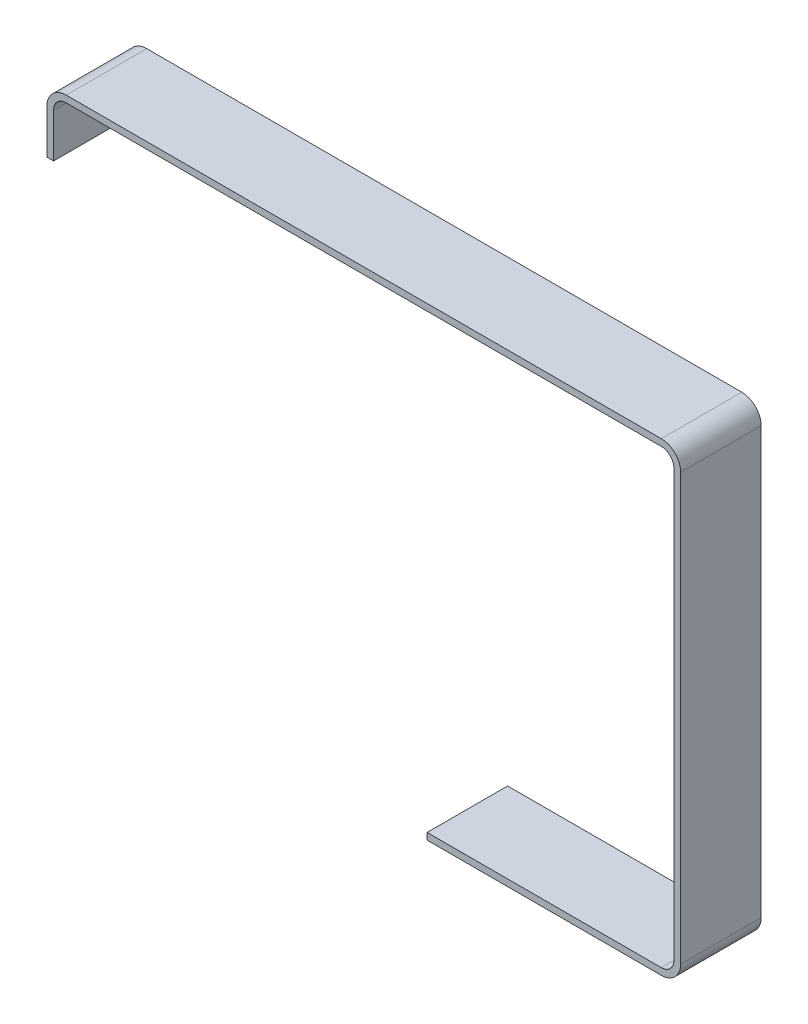
ISO-10303-21;
HEADER;
FILE_DESCRIPTION(('STEP AP214'),'2;1');
FILE_NAME('part.step','',(''),(''),'','','');
FILE_SCHEMA(('AUTOMOTIVE_DESIGN { 1 0 10303 214 1 1 1 1 }'));
ENDSEC;
DATA;
#1=APPLICATION_CONTEXT('core data for automotive mechanical design processes');
#2=APPLICATION_PROTOCOL_DEFINITION('international standard','automotive_design',2000,#1);
#3=PRODUCT_CONTEXT('',#1,'mechanical');
#4=PRODUCT('Part','Part','',(#3));
#5=PRODUCT_RELATED_PRODUCT_CATEGORY('part','',(#4));
#6=PRODUCT_DEFINITION_FORMATION('','',#4);
#7=PRODUCT_DEFINITION_CONTEXT('part definition',#1,'design');
#8=PRODUCT_DEFINITION('design','',#6,#7);
#9=PRODUCT_DEFINITION_SHAPE('','',#8);
#10=(LENGTH_UNIT() NAMED_UNIT(*) SI_UNIT(.MILLI.,.METRE.));
#11=(NAMED_UNIT(*) PLANE_ANGLE_UNIT() SI_UNIT($,.RADIAN.));
#12=(NAMED_UNIT(*) SI_UNIT($,.STERADIAN.) SOLID_ANGLE_UNIT());
#13=UNCERTAINTY_MEASURE_WITH_UNIT(LENGTH_MEASURE(1.E-05),#10,'distance_accuracy_value','');
#14=(GEOMETRIC_REPRESENTATION_CONTEXT(3) GLOBAL_UNCERTAINTY_ASSIGNED_CONTEXT((#13)) GLOBAL_UNIT_ASSIGNED_CONTEXT((#10,
#11,#12)) REPRESENTATION_CONTEXT('',''));
#15=CARTESIAN_POINT('',(0.,0.,0.));
#16=DIRECTION('',(0.,0.,1.));
#17=DIRECTION('',(1.,0.,0.));
#18=AXIS2_PLACEMENT_3D('',#15,#16,#17);
#19=CARTESIAN_POINT('',(-60.,0.,19.05));
#20=DIRECTION('',(1.,0.,0.));
#21=DIRECTION('',(0.,0.,-1.));
#22=AXIS2_PLACEMENT_3D('',#19,#20,#21);
#23=PLANE('',#22);
#24=DIRECTION('',(0.,-1.,0.));
#25=VECTOR('',#24,1.);
#26=CARTESIAN_POINT('',(-60.,0.,0.));
#27=LINE('',#26,#25);
#28=CARTESIAN_POINT('',(-60.,1.5875,0.));
#29=VERTEX_POINT('',#28);
#30=CARTESIAN_POINT('',(-60.,0.,0.));
#31=VERTEX_POINT('',#30);
#32=EDGE_CURVE('E171',#29,#31,#27,.T.);
#33=ORIENTED_EDGE('',*,*,#32,.T.);
#34=DIRECTION('',(0.,0.,-1.));
#35=VECTOR('',#34,1.);
#36=CARTESIAN_POINT('',(-60.,0.,19.05));
#37=LINE('',#36,#35);
#38=CARTESIAN_POINT('',(-60.,0.,19.05));
#39=VERTEX_POINT('',#38);
#40=EDGE_CURVE('E153',#39,#31,#37,.T.);
#41=ORIENTED_EDGE('',*,*,#40,.F.);
#42=DIRECTION('',(0.,-1.,0.));
#43=VECTOR('',#42,1.);
#44=CARTESIAN_POINT('',(-60.,0.,19.05));
#45=LINE('',#44,#43);
#46=CARTESIAN_POINT('',(-60.,1.5875,19.05));
#47=VERTEX_POINT('',#46);
#48=EDGE_CURVE('E159',#47,#39,#45,.T.);
#49=ORIENTED_EDGE('',*,*,#48,.F.);
#50=DIRECTION('',(0.,0.,-1.));
#51=VECTOR('',#50,1.);
#52=CARTESIAN_POINT('',(-60.,1.5875,19.05));
#53=LINE('',#52,#51);
#54=EDGE_CURVE('E256',#47,#29,#53,.T.);
#55=ORIENTED_EDGE('',*,*,#54,.T.);
#56=EDGE_LOOP('',(#33,#41,#49,#55));
#57=FACE_BOUND('',#56,.T.);
#58=ADVANCED_FACE('F33',(#57),#23,.F.);
#59=CARTESIAN_POINT('',(-60.,0.,19.05));
#60=DIRECTION('',(0.,1.,0.));
#61=DIRECTION('',(0.,0.,1.));
#62=AXIS2_PLACEMENT_3D('',#59,#60,#61);
#63=PLANE('',#62);
#64=DIRECTION('',(1.,0.,0.));
#65=VECTOR('',#64,1.);
#66=CARTESIAN_POINT('',(-60.,0.,0.));
#67=LINE('',#66,#65);
#68=CARTESIAN_POINT('',(-4.5875,0.,0.));
#69=VERTEX_POINT('',#68);
#70=EDGE_CURVE('E241',#31,#69,#67,.T.);
#71=ORIENTED_EDGE('',*,*,#70,.T.);
#72=DIRECTION('',(0.,0.,-1.));
#73=VECTOR('',#72,1.);
#74=CARTESIAN_POINT('',(-4.5875,0.,19.05));
#75=LINE('',#74,#73);
#76=CARTESIAN_POINT('',(-4.5875,0.,19.05));
#77=VERTEX_POINT('',#76);
#78=EDGE_CURVE('E156',#69,#77,#75,.F.);
#79=ORIENTED_EDGE('',*,*,#78,.T.);
#80=DIRECTION('',(1.,0.,0.));
#81=VECTOR('',#80,1.);
#82=CARTESIAN_POINT('',(-60.,0.,19.05));
#83=LINE('',#82,#81);
#84=EDGE_CURVE('E148',#39,#77,#83,.T.);
#85=ORIENTED_EDGE('',*,*,#84,.F.);
#86=ORIENTED_EDGE('',*,*,#40,.T.);
#87=EDGE_LOOP('',(#71,#79,#85,#86));
#88=FACE_BOUND('',#87,.T.);
#89=ADVANCED_FACE('F151',(#88),#63,.F.);
#90=CARTESIAN_POINT('',(0.,0.,19.05));
#91=DIRECTION('',(-1.,0.,0.));
#92=DIRECTION('',(0.,0.,1.));
#93=AXIS2_PLACEMENT_3D('',#90,#91,#92);
#94=PLANE('',#93);
#95=DIRECTION('',(0.,1.,0.));
#96=VECTOR('',#95,1.);
#97=CARTESIAN_POINT('',(0.,0.,19.05));
#98=LINE('',#97,#96);
#99=CARTESIAN_POINT('',(0.,4.5875,19.05));
#100=VERTEX_POINT('',#99);
#101=CARTESIAN_POINT('',(0.,105.4125,19.05));
#102=VERTEX_POINT('',#101);
#103=EDGE_CURVE('E158',#100,#102,#98,.T.);
#104=ORIENTED_EDGE('',*,*,#103,.F.);
#105=DIRECTION('',(0.,0.,-1.));
#106=VECTOR('',#105,1.);
#107=CARTESIAN_POINT('',(0.,4.5875,19.05));
#108=LINE('',#107,#106);
#109=CARTESIAN_POINT('',(0.,4.5875,0.));
#110=VERTEX_POINT('',#109);
#111=EDGE_CURVE('E208',#100,#110,#108,.T.);
#112=ORIENTED_EDGE('',*,*,#111,.T.);
#113=DIRECTION('',(0.,1.,0.));
#114=VECTOR('',#113,1.);
#115=CARTESIAN_POINT('',(0.,0.,0.));
#116=LINE('',#115,#114);
#117=CARTESIAN_POINT('',(0.,105.4125,0.));
#118=VERTEX_POINT('',#117);
#119=EDGE_CURVE('E237',#110,#118,#116,.T.);
#120=ORIENTED_EDGE('',*,*,#119,.T.);
#121=DIRECTION('',(0.,0.,-1.));
#122=VECTOR('',#121,1.);
#123=CARTESIAN_POINT('',(0.,105.4125,19.05));
#124=LINE('',#123,#122);
#125=EDGE_CURVE('E206',#118,#102,#124,.F.);
#126=ORIENTED_EDGE('',*,*,#125,.T.);
#127=EDGE_LOOP('',(#104,#112,#120,#126));
#128=FACE_BOUND('',#127,.T.);
#129=ADVANCED_FACE('F296',(#128),#94,.F.);
#130=CARTESIAN_POINT('',(0.,110.,19.05));
#131=DIRECTION('',(0.,-1.,0.));
#132=DIRECTION('',(0.,0.,-1.));
#133=AXIS2_PLACEMENT_3D('',#130,#131,#132);
#134=PLANE('',#133);
#135=DIRECTION('',(-1.,0.,0.));
#136=VECTOR('',#135,1.);
#137=CARTESIAN_POINT('',(0.,110.,19.05));
#138=LINE('',#137,#136);
#139=CARTESIAN_POINT('',(-4.5875,110.,19.05));
#140=VERTEX_POINT('',#139);
#141=CARTESIAN_POINT('',(-145.4125,110.,19.05));
#142=VERTEX_POINT('',#141);
#143=EDGE_CURVE('E228',#140,#142,#138,.T.);
#144=ORIENTED_EDGE('',*,*,#143,.F.);
#145=DIRECTION('',(0.,0.,-1.));
#146=VECTOR('',#145,1.);
#147=CARTESIAN_POINT('',(-4.5875,110.,19.05));
#148=LINE('',#147,#146);
#149=CARTESIAN_POINT('',(-4.5875,110.,0.));
#150=VERTEX_POINT('',#149);
#151=EDGE_CURVE('E41',#140,#150,#148,.T.);
#152=ORIENTED_EDGE('',*,*,#151,.T.);
#153=DIRECTION('',(-1.,0.,0.));
#154=VECTOR('',#153,1.);
#155=CARTESIAN_POINT('',(0.,110.,0.));
#156=LINE('',#155,#154);
#157=CARTESIAN_POINT('',(-145.4125,110.,0.));
#158=VERTEX_POINT('',#157);
#159=EDGE_CURVE('E227',#150,#158,#156,.T.);
#160=ORIENTED_EDGE('',*,*,#159,.T.);
#161=DIRECTION('',(0.,0.,-1.));
#162=VECTOR('',#161,1.);
#163=CARTESIAN_POINT('',(-145.4125,110.,19.05));
#164=LINE('',#163,#162);
#165=EDGE_CURVE('E56',#158,#142,#164,.F.);
#166=ORIENTED_EDGE('',*,*,#165,.T.);
#167=EDGE_LOOP('',(#144,#152,#160,#166));
#168=FACE_BOUND('',#167,.T.);
#169=ADVANCED_FACE('F226',(#168),#134,.F.);
#170=CARTESIAN_POINT('',(-150.,110.,19.05));
#171=DIRECTION('',(1.,0.,0.));
#172=DIRECTION('',(0.,1.,0.));
#173=AXIS2_PLACEMENT_3D('',#170,#171,#172);
#174=PLANE('',#173);
#175=DIRECTION('',(0.,-1.,0.));
#176=VECTOR('',#175,1.);
#177=CARTESIAN_POINT('',(-150.,110.,19.05));
#178=LINE('',#177,#176);
#179=CARTESIAN_POINT('',(-150.,105.4125,19.05));
#180=VERTEX_POINT('',#179);
#181=CARTESIAN_POINT('',(-150.,95.,19.05));
#182=VERTEX_POINT('',#181);
#183=EDGE_CURVE('E299',#180,#182,#178,.T.);
#184=ORIENTED_EDGE('',*,*,#183,.F.);
#185=DIRECTION('',(0.,0.,-1.));
#186=VECTOR('',#185,1.);
#187=CARTESIAN_POINT('',(-150.,105.4125,19.05));
#188=LINE('',#187,#186);
#189=CARTESIAN_POINT('',(-150.,105.4125,0.));
#190=VERTEX_POINT('',#189);
#191=EDGE_CURVE('E11',#180,#190,#188,.T.);
#192=ORIENTED_EDGE('',*,*,#191,.T.);
#193=DIRECTION('',(0.,-1.,0.));
#194=VECTOR('',#193,1.);
#195=CARTESIAN_POINT('',(-150.,110.,0.));
#196=LINE('',#195,#194);
#197=CARTESIAN_POINT('',(-150.,95.,0.));
#198=VERTEX_POINT('',#197);
#199=EDGE_CURVE('E236',#190,#198,#196,.T.);
#200=ORIENTED_EDGE('',*,*,#199,.T.);
#201=DIRECTION('',(0.,0.,-1.));
#202=VECTOR('',#201,1.);
#203=CARTESIAN_POINT('',(-150.,95.,19.05));
#204=LINE('',#203,#202);
#205=EDGE_CURVE('E173',#182,#198,#204,.T.);
#206=ORIENTED_EDGE('',*,*,#205,.F.);
#207=EDGE_LOOP('',(#184,#192,#200,#206));
#208=FACE_BOUND('',#207,.T.);
#209=ADVANCED_FACE('F305',(#208),#174,.F.);
#210=CARTESIAN_POINT('',(-150.,95.,19.05));
#211=DIRECTION('',(0.,1.,0.));
#212=DIRECTION('',(0.,0.,1.));
#213=AXIS2_PLACEMENT_3D('',#210,#211,#212);
#214=PLANE('',#213);
#215=DIRECTION('',(1.,0.,0.));
#216=VECTOR('',#215,1.);
#217=CARTESIAN_POINT('',(-150.,95.,0.));
#218=LINE('',#217,#216);
#219=CARTESIAN_POINT('',(-148.4125,95.,0.));
#220=VERTEX_POINT('',#219);
#221=EDGE_CURVE('E239',#198,#220,#218,.T.);
#222=ORIENTED_EDGE('',*,*,#221,.T.);
#223=DIRECTION('',(0.,0.,-1.));
#224=VECTOR('',#223,1.);
#225=CARTESIAN_POINT('',(-148.4125,95.,19.05));
#226=LINE('',#225,#224);
#227=CARTESIAN_POINT('',(-148.4125,95.,19.05));
#228=VERTEX_POINT('',#227);
#229=EDGE_CURVE('E179',#228,#220,#226,.T.);
#230=ORIENTED_EDGE('',*,*,#229,.F.);
#231=DIRECTION('',(1.,0.,0.));
#232=VECTOR('',#231,1.);
#233=CARTESIAN_POINT('',(-150.,95.,19.05));
#234=LINE('',#233,#232);
#235=EDGE_CURVE('E285',#182,#228,#234,.T.);
#236=ORIENTED_EDGE('',*,*,#235,.F.);
#237=ORIENTED_EDGE('',*,*,#205,.T.);
#238=EDGE_LOOP('',(#222,#230,#236,#237));
#239=FACE_BOUND('',#238,.T.);
#240=ADVANCED_FACE('F303',(#239),#214,.F.);
#241=CARTESIAN_POINT('',(-148.4125,108.4125,19.05));
#242=DIRECTION('',(-1.,0.,0.));
#243=DIRECTION('',(0.,0.,1.));
#244=AXIS2_PLACEMENT_3D('',#241,#242,#243);
#245=PLANE('',#244);
#246=DIRECTION('',(0.,1.,0.));
#247=VECTOR('',#246,1.);
#248=CARTESIAN_POINT('',(-148.4125,108.4125,0.));
#249=LINE('',#248,#247);
#250=CARTESIAN_POINT('',(-148.4125,105.4125,0.));
#251=VERTEX_POINT('',#250);
#252=EDGE_CURVE('E246',#220,#251,#249,.T.);
#253=ORIENTED_EDGE('',*,*,#252,.T.);
#254=DIRECTION('',(0.,0.,-1.));
#255=VECTOR('',#254,1.);
#256=CARTESIAN_POINT('',(-148.4125,105.4125,19.05));
#257=LINE('',#256,#255);
#258=CARTESIAN_POINT('',(-148.4125,105.4125,19.05));
#259=VERTEX_POINT('',#258);
#260=EDGE_CURVE('E192',#251,#259,#257,.F.);
#261=ORIENTED_EDGE('',*,*,#260,.T.);
#262=DIRECTION('',(0.,1.,0.));
#263=VECTOR('',#262,1.);
#264=CARTESIAN_POINT('',(-148.4125,108.4125,19.05));
#265=LINE('',#264,#263);
#266=EDGE_CURVE('E265',#228,#259,#265,.T.);
#267=ORIENTED_EDGE('',*,*,#266,.F.);
#268=ORIENTED_EDGE('',*,*,#229,.T.);
#269=EDGE_LOOP('',(#253,#261,#267,#268));
#270=FACE_BOUND('',#269,.T.);
#271=ADVANCED_FACE('F262',(#270),#245,.F.);
#272=CARTESIAN_POINT('',(-1.5875,108.4125,19.05));
#273=DIRECTION('',(0.,1.,0.));
#274=DIRECTION('',(-1.,0.,0.));
#275=AXIS2_PLACEMENT_3D('',#272,#273,#274);
#276=PLANE('',#275);
#277=DIRECTION('',(1.,0.,0.));
#278=VECTOR('',#277,1.);
#279=CARTESIAN_POINT('',(-1.5875,108.4125,0.));
#280=LINE('',#279,#278);
#281=CARTESIAN_POINT('',(-145.4125,108.4125,0.));
#282=VERTEX_POINT('',#281);
#283=CARTESIAN_POINT('',(-4.5875,108.4125,0.));
#284=VERTEX_POINT('',#283);
#285=EDGE_CURVE('E249',#282,#284,#280,.T.);
#286=ORIENTED_EDGE('',*,*,#285,.T.);
#287=DIRECTION('',(0.,0.,-1.));
#288=VECTOR('',#287,1.);
#289=CARTESIAN_POINT('',(-4.5875,108.4125,19.05));
#290=LINE('',#289,#288);
#291=CARTESIAN_POINT('',(-4.5875,108.4125,19.05));
#292=VERTEX_POINT('',#291);
#293=EDGE_CURVE('E190',#284,#292,#290,.F.);
#294=ORIENTED_EDGE('',*,*,#293,.T.);
#295=DIRECTION('',(1.,0.,0.));
#296=VECTOR('',#295,1.);
#297=CARTESIAN_POINT('',(-1.5875,108.4125,19.05));
#298=LINE('',#297,#296);
#299=CARTESIAN_POINT('',(-145.4125,108.4125,19.05));
#300=VERTEX_POINT('',#299);
#301=EDGE_CURVE('E279',#300,#292,#298,.T.);
#302=ORIENTED_EDGE('',*,*,#301,.F.);
#303=DIRECTION('',(0.,0.,-1.));
#304=VECTOR('',#303,1.);
#305=CARTESIAN_POINT('',(-145.4125,108.4125,0.));
#306=LINE('',#305,#304);
#307=EDGE_CURVE('E187',#300,#282,#306,.T.);
#308=ORIENTED_EDGE('',*,*,#307,.T.);
#309=EDGE_LOOP('',(#286,#294,#302,#308));
#310=FACE_BOUND('',#309,.T.);
#311=ADVANCED_FACE('F276',(#310),#276,.F.);
#312=CARTESIAN_POINT('',(-1.5875,1.5875,19.05));
#313=DIRECTION('',(1.,0.,0.));
#314=DIRECTION('',(0.,0.,-1.));
#315=AXIS2_PLACEMENT_3D('',#312,#313,#314);
#316=PLANE('',#315);
#317=DIRECTION('',(0.,-1.,0.));
#318=VECTOR('',#317,1.);
#319=CARTESIAN_POINT('',(-1.5875,1.5875,0.));
#320=LINE('',#319,#318);
#321=CARTESIAN_POINT('',(-1.5875,105.4125,0.));
#322=VERTEX_POINT('',#321);
#323=CARTESIAN_POINT('',(-1.5875,4.5875,0.));
#324=VERTEX_POINT('',#323);
#325=EDGE_CURVE('E252',#322,#324,#320,.T.);
#326=ORIENTED_EDGE('',*,*,#325,.T.);
#327=DIRECTION('',(0.,0.,-1.));
#328=VECTOR('',#327,1.);
#329=CARTESIAN_POINT('',(-1.5875,4.5875,19.05));
#330=LINE('',#329,#328);
#331=CARTESIAN_POINT('',(-1.5875,4.5875,19.05));
#332=VERTEX_POINT('',#331);
#333=EDGE_CURVE('E185',#324,#332,#330,.F.);
#334=ORIENTED_EDGE('',*,*,#333,.T.);
#335=DIRECTION('',(0.,-1.,0.));
#336=VECTOR('',#335,1.);
#337=CARTESIAN_POINT('',(-1.5875,1.5875,19.05));
#338=LINE('',#337,#336);
#339=CARTESIAN_POINT('',(-1.5875,105.4125,19.05));
#340=VERTEX_POINT('',#339);
#341=EDGE_CURVE('E281',#340,#332,#338,.T.);
#342=ORIENTED_EDGE('',*,*,#341,.F.);
#343=DIRECTION('',(0.,0.,-1.));
#344=VECTOR('',#343,1.);
#345=CARTESIAN_POINT('',(-1.5875,105.4125,0.));
#346=LINE('',#345,#344);
#347=EDGE_CURVE('E176',#340,#322,#346,.T.);
#348=ORIENTED_EDGE('',*,*,#347,.T.);
#349=EDGE_LOOP('',(#326,#334,#342,#348));
#350=FACE_BOUND('',#349,.T.);
#351=ADVANCED_FACE('F387',(#350),#316,.F.);
#352=CARTESIAN_POINT('',(-60.,1.5875,19.05));
#353=DIRECTION('',(0.,-1.,0.));
#354=DIRECTION('',(0.,0.,-1.));
#355=AXIS2_PLACEMENT_3D('',#352,#353,#354);
#356=PLANE('',#355);
#357=DIRECTION('',(-1.,0.,0.));
#358=VECTOR('',#357,1.);
#359=CARTESIAN_POINT('',(-60.,1.5875,19.05));
#360=LINE('',#359,#358);
#361=CARTESIAN_POINT('',(-4.58750000000002,1.5875,19.05));
#362=VERTEX_POINT('',#361);
#363=EDGE_CURVE('E164',#362,#47,#360,.T.);
#364=ORIENTED_EDGE('',*,*,#363,.F.);
#365=DIRECTION('',(0.,0.,-1.));
#366=VECTOR('',#365,1.);
#367=CARTESIAN_POINT('',(-4.5875,1.5875,0.));
#368=LINE('',#367,#366);
#369=CARTESIAN_POINT('',(-4.58750000000002,1.5875,0.));
#370=VERTEX_POINT('',#369);
#371=EDGE_CURVE('E172',#362,#370,#368,.T.);
#372=ORIENTED_EDGE('',*,*,#371,.T.);
#373=DIRECTION('',(-1.,0.,0.));
#374=VECTOR('',#373,1.);
#375=CARTESIAN_POINT('',(-60.,1.5875,0.));
#376=LINE('',#375,#374);
#377=EDGE_CURVE('E168',#370,#29,#376,.T.);
#378=ORIENTED_EDGE('',*,*,#377,.T.);
#379=ORIENTED_EDGE('',*,*,#54,.F.);
#380=EDGE_LOOP('',(#364,#372,#378,#379));
#381=FACE_BOUND('',#380,.T.);
#382=ADVANCED_FACE('F379',(#381),#356,.F.);
#383=CARTESIAN_POINT('',(0.,0.,19.05));
#384=DIRECTION('',(0.,0.,-1.));
#385=DIRECTION('',(-1.,0.,0.));
#386=AXIS2_PLACEMENT_3D('',#383,#384,#385);
#387=PLANE('',#386);
#388=ORIENTED_EDGE('',*,*,#84,.T.);
#389=CARTESIAN_POINT('',(-4.5875,4.5875,19.05));
#390=DIRECTION('',(0.,0.,-1.));
#391=DIRECTION('',(-1.,0.,0.));
#392=AXIS2_PLACEMENT_3D('',#389,#390,#391);
#393=CIRCLE('',#392,4.5875);
#394=EDGE_CURVE('E221',#77,#100,#393,.F.);
#395=ORIENTED_EDGE('',*,*,#394,.T.);
#396=ORIENTED_EDGE('',*,*,#103,.T.);
#397=CARTESIAN_POINT('',(-4.5875,105.4125,19.05));
#398=DIRECTION('',(0.,0.,-1.));
#399=DIRECTION('',(-1.,0.,0.));
#400=AXIS2_PLACEMENT_3D('',#397,#398,#399);
#401=CIRCLE('',#400,4.5875);
#402=EDGE_CURVE('E219',#102,#140,#401,.F.);
#403=ORIENTED_EDGE('',*,*,#402,.T.);
#404=ORIENTED_EDGE('',*,*,#143,.T.);
#405=CARTESIAN_POINT('',(-145.4125,105.4125,19.05));
#406=DIRECTION('',(0.,0.,-1.));
#407=DIRECTION('',(-1.,0.,0.));
#408=AXIS2_PLACEMENT_3D('',#405,#406,#407);
#409=CIRCLE('',#408,4.5875);
#410=EDGE_CURVE('E48',#142,#180,#409,.F.);
#411=ORIENTED_EDGE('',*,*,#410,.T.);
#412=ORIENTED_EDGE('',*,*,#183,.T.);
#413=ORIENTED_EDGE('',*,*,#235,.T.);
#414=ORIENTED_EDGE('',*,*,#266,.T.);
#415=CARTESIAN_POINT('',(-145.4125,105.4125,19.05));
#416=DIRECTION('',(0.,0.,-1.));
#417=DIRECTION('',(-1.,0.,0.));
#418=AXIS2_PLACEMENT_3D('',#415,#416,#417);
#419=CIRCLE('',#418,3.);
#420=EDGE_CURVE('E204',#259,#300,#419,.T.);
#421=ORIENTED_EDGE('',*,*,#420,.T.);
#422=ORIENTED_EDGE('',*,*,#301,.T.);
#423=CARTESIAN_POINT('',(-4.5875,105.4125,19.05));
#424=DIRECTION('',(0.,0.,-1.));
#425=DIRECTION('',(-1.,0.,0.));
#426=AXIS2_PLACEMENT_3D('',#423,#424,#425);
#427=CIRCLE('',#426,3.);
#428=EDGE_CURVE('E200',#292,#340,#427,.T.);
#429=ORIENTED_EDGE('',*,*,#428,.T.);
#430=ORIENTED_EDGE('',*,*,#341,.T.);
#431=CARTESIAN_POINT('',(-4.5875,4.5875,19.05));
#432=DIRECTION('',(0.,0.,-1.));
#433=DIRECTION('',(-1.,0.,0.));
#434=AXIS2_PLACEMENT_3D('',#431,#432,#433);
#435=CIRCLE('',#434,3.);
#436=EDGE_CURVE('E196',#332,#362,#435,.T.);
#437=ORIENTED_EDGE('',*,*,#436,.T.);
#438=ORIENTED_EDGE('',*,*,#363,.T.);
#439=ORIENTED_EDGE('',*,*,#48,.T.);
#440=EDGE_LOOP('',(#388,#395,#396,#403,#404,#411,#412,#413,#414,#421,#422,#429,#430,#437,#438,#439));
#441=FACE_BOUND('',#440,.T.);
#442=ADVANCED_FACE('F162',(#441),#387,.F.);
#443=CARTESIAN_POINT('',(0.,0.,0.));
#444=DIRECTION('',(0.,0.,-1.));
#445=DIRECTION('',(-1.,0.,0.));
#446=AXIS2_PLACEMENT_3D('',#443,#444,#445);
#447=PLANE('',#446);
#448=ORIENTED_EDGE('',*,*,#119,.F.);
#449=CARTESIAN_POINT('',(-4.5875,4.5875,0.));
#450=DIRECTION('',(0.,0.,-1.));
#451=DIRECTION('',(-1.,0.,0.));
#452=AXIS2_PLACEMENT_3D('',#449,#450,#451);
#453=CIRCLE('',#452,4.5875);
#454=EDGE_CURVE('E215',#110,#69,#453,.T.);
#455=ORIENTED_EDGE('',*,*,#454,.T.);
#456=ORIENTED_EDGE('',*,*,#70,.F.);
#457=ORIENTED_EDGE('',*,*,#32,.F.);
#458=ORIENTED_EDGE('',*,*,#377,.F.);
#459=CARTESIAN_POINT('',(-4.5875,4.5875,0.));
#460=DIRECTION('',(0.,0.,-1.));
#461=DIRECTION('',(-1.,0.,0.));
#462=AXIS2_PLACEMENT_3D('',#459,#460,#461);
#463=CIRCLE('',#462,3.);
#464=EDGE_CURVE('E194',#370,#324,#463,.F.);
#465=ORIENTED_EDGE('',*,*,#464,.T.);
#466=ORIENTED_EDGE('',*,*,#325,.F.);
#467=CARTESIAN_POINT('',(-4.5875,105.4125,0.));
#468=DIRECTION('',(0.,0.,-1.));
#469=DIRECTION('',(-1.,0.,0.));
#470=AXIS2_PLACEMENT_3D('',#467,#468,#469);
#471=CIRCLE('',#470,3.);
#472=EDGE_CURVE('E198',#322,#284,#471,.F.);
#473=ORIENTED_EDGE('',*,*,#472,.T.);
#474=ORIENTED_EDGE('',*,*,#285,.F.);
#475=CARTESIAN_POINT('',(-145.4125,105.4125,0.));
#476=DIRECTION('',(0.,0.,-1.));
#477=DIRECTION('',(-1.,0.,0.));
#478=AXIS2_PLACEMENT_3D('',#475,#476,#477);
#479=CIRCLE('',#478,3.);
#480=EDGE_CURVE('E202',#282,#251,#479,.F.);
#481=ORIENTED_EDGE('',*,*,#480,.T.);
#482=ORIENTED_EDGE('',*,*,#252,.F.);
#483=ORIENTED_EDGE('',*,*,#221,.F.);
#484=ORIENTED_EDGE('',*,*,#199,.F.);
#485=CARTESIAN_POINT('',(-145.4125,105.4125,0.));
#486=DIRECTION('',(0.,0.,-1.));
#487=DIRECTION('',(-1.,0.,0.));
#488=AXIS2_PLACEMENT_3D('',#485,#486,#487);
#489=CIRCLE('',#488,4.5875);
#490=EDGE_CURVE('E211',#190,#158,#489,.T.);
#491=ORIENTED_EDGE('',*,*,#490,.T.);
#492=ORIENTED_EDGE('',*,*,#159,.F.);
#493=CARTESIAN_POINT('',(-4.5875,105.4125,0.));
#494=DIRECTION('',(0.,0.,-1.));
#495=DIRECTION('',(-1.,0.,0.));
#496=AXIS2_PLACEMENT_3D('',#493,#494,#495);
#497=CIRCLE('',#496,4.5875);
#498=EDGE_CURVE('E213',#150,#118,#497,.T.);
#499=ORIENTED_EDGE('',*,*,#498,.T.);
#500=EDGE_LOOP('',(#448,#455,#456,#457,#458,#465,#466,#473,#474,#481,#482,#483,#484,#491,#492,#499));
#501=FACE_BOUND('',#500,.T.);
#502=ADVANCED_FACE('F233',(#501),#447,.T.);
#503=CARTESIAN_POINT('',(-4.5875,4.5875,19.05));
#504=DIRECTION('',(0.,0.,1.));
#505=DIRECTION('',(1.,0.,0.));
#506=AXIS2_PLACEMENT_3D('',#503,#504,#505);
#507=CYLINDRICAL_SURFACE('',#506,3.);
#508=ORIENTED_EDGE('',*,*,#436,.F.);
#509=ORIENTED_EDGE('',*,*,#333,.F.);
#510=ORIENTED_EDGE('',*,*,#464,.F.);
#511=ORIENTED_EDGE('',*,*,#371,.F.);
#512=EDGE_LOOP('',(#508,#509,#510,#511));
#513=FACE_BOUND('',#512,.T.);
#514=ADVANCED_FACE('F321',(#513),#507,.F.);
#515=CARTESIAN_POINT('',(-4.5875,105.4125,19.05));
#516=DIRECTION('',(0.,0.,1.));
#517=DIRECTION('',(1.,0.,0.));
#518=AXIS2_PLACEMENT_3D('',#515,#516,#517);
#519=CYLINDRICAL_SURFACE('',#518,3.);
#520=ORIENTED_EDGE('',*,*,#428,.F.);
#521=ORIENTED_EDGE('',*,*,#293,.F.);
#522=ORIENTED_EDGE('',*,*,#472,.F.);
#523=ORIENTED_EDGE('',*,*,#347,.F.);
#524=EDGE_LOOP('',(#520,#521,#522,#523));
#525=FACE_BOUND('',#524,.T.);
#526=ADVANCED_FACE('F324',(#525),#519,.F.);
#527=CARTESIAN_POINT('',(-145.4125,105.4125,19.05));
#528=DIRECTION('',(0.,0.,1.));
#529=DIRECTION('',(1.,0.,0.));
#530=AXIS2_PLACEMENT_3D('',#527,#528,#529);
#531=CYLINDRICAL_SURFACE('',#530,3.);
#532=ORIENTED_EDGE('',*,*,#420,.F.);
#533=ORIENTED_EDGE('',*,*,#260,.F.);
#534=ORIENTED_EDGE('',*,*,#480,.F.);
#535=ORIENTED_EDGE('',*,*,#307,.F.);
#536=EDGE_LOOP('',(#532,#533,#534,#535));
#537=FACE_BOUND('',#536,.T.);
#538=ADVANCED_FACE('F273',(#537),#531,.F.);
#539=CARTESIAN_POINT('',(-4.5875,4.5875,19.05));
#540=DIRECTION('',(0.,0.,-1.));
#541=DIRECTION('',(-1.,0.,0.));
#542=AXIS2_PLACEMENT_3D('',#539,#540,#541);
#543=CYLINDRICAL_SURFACE('',#542,4.5875);
#544=ORIENTED_EDGE('',*,*,#394,.F.);
#545=ORIENTED_EDGE('',*,*,#78,.F.);
#546=ORIENTED_EDGE('',*,*,#454,.F.);
#547=ORIENTED_EDGE('',*,*,#111,.F.);
#548=EDGE_LOOP('',(#544,#545,#546,#547));
#549=FACE_BOUND('',#548,.T.);
#550=ADVANCED_FACE('F291',(#549),#543,.T.);
#551=CARTESIAN_POINT('',(-4.5875,105.4125,19.05));
#552=DIRECTION('',(0.,0.,-1.));
#553=DIRECTION('',(-1.,0.,0.));
#554=AXIS2_PLACEMENT_3D('',#551,#552,#553);
#555=CYLINDRICAL_SURFACE('',#554,4.5875);
#556=ORIENTED_EDGE('',*,*,#402,.F.);
#557=ORIENTED_EDGE('',*,*,#125,.F.);
#558=ORIENTED_EDGE('',*,*,#498,.F.);
#559=ORIENTED_EDGE('',*,*,#151,.F.);
#560=EDGE_LOOP('',(#556,#557,#558,#559));
#561=FACE_BOUND('',#560,.T.);
#562=ADVANCED_FACE('F309',(#561),#555,.T.);
#563=CARTESIAN_POINT('',(-145.4125,105.4125,19.05));
#564=DIRECTION('',(0.,0.,-1.));
#565=DIRECTION('',(-1.,0.,0.));
#566=AXIS2_PLACEMENT_3D('',#563,#564,#565);
#567=CYLINDRICAL_SURFACE('',#566,4.5875);
#568=ORIENTED_EDGE('',*,*,#410,.F.);
#569=ORIENTED_EDGE('',*,*,#165,.F.);
#570=ORIENTED_EDGE('',*,*,#490,.F.);
#571=ORIENTED_EDGE('',*,*,#191,.F.);
#572=EDGE_LOOP('',(#568,#569,#570,#571));
#573=FACE_BOUND('',#572,.T.);
#574=ADVANCED_FACE('F35',(#573),#567,.T.);
#575=CLOSED_SHELL('',(#58,#89,#129,#169,#209,#240,#271,#311,#351,#382,#442,#502,#514,#526,#538,
#550,#562,#574));
#576=MANIFOLD_SOLID_BREP('B2',#575);
#577=ADVANCED_BREP_SHAPE_REPRESENTATION('',(#18,#576),#14);
#578=SHAPE_DEFINITION_REPRESENTATION(#9,#577);
ENDSEC;
END-ISO-10303-21;
